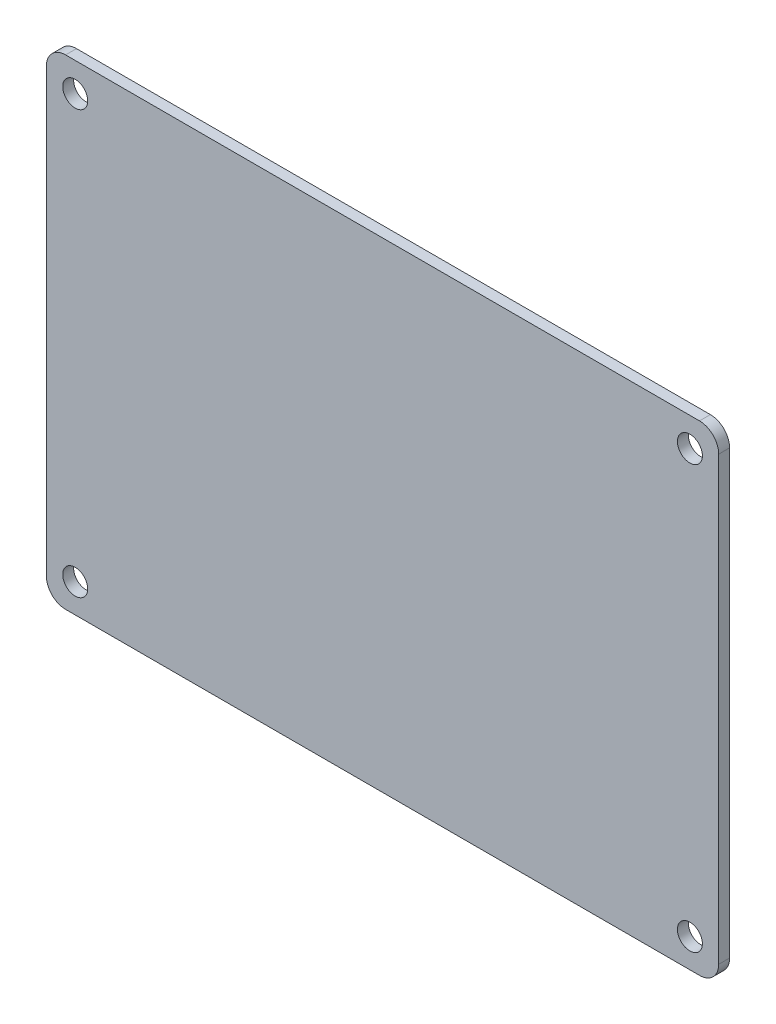
ISO-10303-21;
HEADER;
FILE_DESCRIPTION(('STEP AP214'),'2;1');
FILE_NAME('part.step','',(''),(''),'','','');
FILE_SCHEMA(('AUTOMOTIVE_DESIGN { 1 0 10303 214 1 1 1 1 }'));
ENDSEC;
DATA;
#1=APPLICATION_CONTEXT('core data for automotive mechanical design processes');
#2=APPLICATION_PROTOCOL_DEFINITION('international standard','automotive_design',2000,#1);
#3=PRODUCT_CONTEXT('',#1,'mechanical');
#4=PRODUCT('Part','Part','',(#3));
#5=PRODUCT_RELATED_PRODUCT_CATEGORY('part','',(#4));
#6=PRODUCT_DEFINITION_FORMATION('','',#4);
#7=PRODUCT_DEFINITION_CONTEXT('part definition',#1,'design');
#8=PRODUCT_DEFINITION('design','',#6,#7);
#9=PRODUCT_DEFINITION_SHAPE('','',#8);
#10=(LENGTH_UNIT() NAMED_UNIT(*) SI_UNIT(.MILLI.,.METRE.));
#11=(NAMED_UNIT(*) PLANE_ANGLE_UNIT() SI_UNIT($,.RADIAN.));
#12=(NAMED_UNIT(*) SI_UNIT($,.STERADIAN.) SOLID_ANGLE_UNIT());
#13=UNCERTAINTY_MEASURE_WITH_UNIT(LENGTH_MEASURE(1.E-05),#10,'distance_accuracy_value','');
#14=(GEOMETRIC_REPRESENTATION_CONTEXT(3) GLOBAL_UNCERTAINTY_ASSIGNED_CONTEXT((#13)) GLOBAL_UNIT_ASSIGNED_CONTEXT((#10,
#11,#12)) REPRESENTATION_CONTEXT('',''));
#15=CARTESIAN_POINT('',(0.,0.,0.));
#16=DIRECTION('',(0.,0.,1.));
#17=DIRECTION('',(1.,0.,0.));
#18=AXIS2_PLACEMENT_3D('',#15,#16,#17);
#19=CARTESIAN_POINT('',(-48.,-33.,1.7));
#20=DIRECTION('',(0.,0.,1.));
#21=DIRECTION('',(1.,0.,0.));
#22=AXIS2_PLACEMENT_3D('',#19,#20,#21);
#23=CYLINDRICAL_SURFACE('',#22,1.95);
#24=CARTESIAN_POINT('',(-48.,-33.,0.));
#25=DIRECTION('',(0.,0.,1.));
#26=DIRECTION('',(1.,0.,0.));
#27=AXIS2_PLACEMENT_3D('',#24,#25,#26);
#28=CIRCLE('',#27,1.95);
#29=CARTESIAN_POINT('',(-46.05,-33.,0.));
#30=VERTEX_POINT('',#29);
#31=EDGE_CURVE('E132',#30,#30,#28,.T.);
#32=ORIENTED_EDGE('',*,*,#31,.F.);
#33=EDGE_LOOP('',(#32));
#34=FACE_BOUND('',#33,.T.);
#35=CARTESIAN_POINT('',(-48.,-33.,1.7));
#36=DIRECTION('',(0.,0.,1.));
#37=DIRECTION('',(1.,0.,0.));
#38=AXIS2_PLACEMENT_3D('',#35,#36,#37);
#39=CIRCLE('',#38,1.95);
#40=CARTESIAN_POINT('',(-46.05,-33.,1.7));
#41=VERTEX_POINT('',#40);
#42=EDGE_CURVE('E127',#41,#41,#39,.T.);
#43=ORIENTED_EDGE('',*,*,#42,.T.);
#44=EDGE_LOOP('',(#43));
#45=FACE_BOUND('',#44,.T.);
#46=ADVANCED_FACE('F33',(#34,#45),#23,.F.);
#47=CARTESIAN_POINT('',(48.,-33.,1.7));
#48=DIRECTION('',(0.,0.,1.));
#49=DIRECTION('',(1.,0.,0.));
#50=AXIS2_PLACEMENT_3D('',#47,#48,#49);
#51=CYLINDRICAL_SURFACE('',#50,1.95);
#52=CARTESIAN_POINT('',(48.,-33.,0.));
#53=DIRECTION('',(0.,0.,1.));
#54=DIRECTION('',(1.,0.,0.));
#55=AXIS2_PLACEMENT_3D('',#52,#53,#54);
#56=CIRCLE('',#55,1.95);
#57=CARTESIAN_POINT('',(49.95,-33.,0.));
#58=VERTEX_POINT('',#57);
#59=EDGE_CURVE('E158',#58,#58,#56,.T.);
#60=ORIENTED_EDGE('',*,*,#59,.F.);
#61=EDGE_LOOP('',(#60));
#62=FACE_BOUND('',#61,.T.);
#63=CARTESIAN_POINT('',(48.,-33.,1.7));
#64=DIRECTION('',(0.,0.,1.));
#65=DIRECTION('',(1.,0.,0.));
#66=AXIS2_PLACEMENT_3D('',#63,#64,#65);
#67=CIRCLE('',#66,1.95);
#68=CARTESIAN_POINT('',(49.95,-33.,1.7));
#69=VERTEX_POINT('',#68);
#70=EDGE_CURVE('E162',#69,#69,#67,.T.);
#71=ORIENTED_EDGE('',*,*,#70,.T.);
#72=EDGE_LOOP('',(#71));
#73=FACE_BOUND('',#72,.T.);
#74=ADVANCED_FACE('F181',(#62,#73),#51,.F.);
#75=CARTESIAN_POINT('',(52.5,-37.5,1.7));
#76=DIRECTION('',(0.,-1.,0.));
#77=DIRECTION('',(1.,0.,0.));
#78=AXIS2_PLACEMENT_3D('',#75,#76,#77);
#79=PLANE('',#78);
#80=DIRECTION('',(-1.,0.,0.));
#81=VECTOR('',#80,1.);
#82=CARTESIAN_POINT('',(52.5,-37.5,1.7));
#83=LINE('',#82,#81);
#84=CARTESIAN_POINT('',(49.5,-37.5,1.7));
#85=VERTEX_POINT('',#84);
#86=CARTESIAN_POINT('',(-49.5,-37.5,1.7));
#87=VERTEX_POINT('',#86);
#88=EDGE_CURVE('E172',#85,#87,#83,.T.);
#89=ORIENTED_EDGE('',*,*,#88,.T.);
#90=DIRECTION('',(0.,0.,-1.));
#91=VECTOR('',#90,1.);
#92=CARTESIAN_POINT('',(-49.5,-37.5,1.7));
#93=LINE('',#92,#91);
#94=CARTESIAN_POINT('',(-49.5,-37.5,0.));
#95=VERTEX_POINT('',#94);
#96=EDGE_CURVE('E120',#87,#95,#93,.T.);
#97=ORIENTED_EDGE('',*,*,#96,.T.);
#98=DIRECTION('',(-1.,0.,0.));
#99=VECTOR('',#98,1.);
#100=CARTESIAN_POINT('',(52.5,-37.5,0.));
#101=LINE('',#100,#99);
#102=CARTESIAN_POINT('',(49.5,-37.5,0.));
#103=VERTEX_POINT('',#102);
#104=EDGE_CURVE('E103',#103,#95,#101,.T.);
#105=ORIENTED_EDGE('',*,*,#104,.F.);
#106=DIRECTION('',(0.,0.,-1.));
#107=VECTOR('',#106,1.);
#108=CARTESIAN_POINT('',(49.5,-37.5,1.7));
#109=LINE('',#108,#107);
#110=EDGE_CURVE('E117',#103,#85,#109,.F.);
#111=ORIENTED_EDGE('',*,*,#110,.T.);
#112=EDGE_LOOP('',(#89,#97,#105,#111));
#113=FACE_BOUND('',#112,.T.);
#114=ADVANCED_FACE('F116',(#113),#79,.T.);
#115=CARTESIAN_POINT('',(52.5,-37.5,1.7));
#116=DIRECTION('',(-1.,0.,0.));
#117=DIRECTION('',(0.,0.,1.));
#118=AXIS2_PLACEMENT_3D('',#115,#116,#117);
#119=PLANE('',#118);
#120=DIRECTION('',(0.,1.,0.));
#121=VECTOR('',#120,1.);
#122=CARTESIAN_POINT('',(52.5,-37.5,1.7));
#123=LINE('',#122,#121);
#124=CARTESIAN_POINT('',(52.5,-34.5,1.7));
#125=VERTEX_POINT('',#124);
#126=CARTESIAN_POINT('',(52.5,34.5,1.7));
#127=VERTEX_POINT('',#126);
#128=EDGE_CURVE('E157',#125,#127,#123,.T.);
#129=ORIENTED_EDGE('',*,*,#128,.F.);
#130=DIRECTION('',(0.,0.,-1.));
#131=VECTOR('',#130,1.);
#132=CARTESIAN_POINT('',(52.5,-34.5,0.));
#133=LINE('',#132,#131);
#134=CARTESIAN_POINT('',(52.5,-34.5,0.));
#135=VERTEX_POINT('',#134);
#136=EDGE_CURVE('E152',#125,#135,#133,.T.);
#137=ORIENTED_EDGE('',*,*,#136,.T.);
#138=DIRECTION('',(0.,1.,0.));
#139=VECTOR('',#138,1.);
#140=CARTESIAN_POINT('',(52.5,-37.5,0.));
#141=LINE('',#140,#139);
#142=CARTESIAN_POINT('',(52.5,34.5,0.));
#143=VERTEX_POINT('',#142);
#144=EDGE_CURVE('E105',#135,#143,#141,.T.);
#145=ORIENTED_EDGE('',*,*,#144,.T.);
#146=DIRECTION('',(0.,0.,-1.));
#147=VECTOR('',#146,1.);
#148=CARTESIAN_POINT('',(52.5,34.5,1.7));
#149=LINE('',#148,#147);
#150=EDGE_CURVE('E150',#143,#127,#149,.F.);
#151=ORIENTED_EDGE('',*,*,#150,.T.);
#152=EDGE_LOOP('',(#129,#137,#145,#151));
#153=FACE_BOUND('',#152,.T.);
#154=ADVANCED_FACE('F155',(#153),#119,.F.);
#155=CARTESIAN_POINT('',(52.5,37.5,1.7));
#156=DIRECTION('',(0.,-1.,0.));
#157=DIRECTION('',(1.,0.,0.));
#158=AXIS2_PLACEMENT_3D('',#155,#156,#157);
#159=PLANE('',#158);
#160=DIRECTION('',(-1.,0.,0.));
#161=VECTOR('',#160,1.);
#162=CARTESIAN_POINT('',(52.5,37.5,1.7));
#163=LINE('',#162,#161);
#164=CARTESIAN_POINT('',(49.5,37.5,1.7));
#165=VERTEX_POINT('',#164);
#166=CARTESIAN_POINT('',(-49.5,37.5,1.7));
#167=VERTEX_POINT('',#166);
#168=EDGE_CURVE('E159',#165,#167,#163,.T.);
#169=ORIENTED_EDGE('',*,*,#168,.F.);
#170=DIRECTION('',(0.,0.,-1.));
#171=VECTOR('',#170,1.);
#172=CARTESIAN_POINT('',(49.5,37.5,1.7));
#173=LINE('',#172,#171);
#174=CARTESIAN_POINT('',(49.5,37.5,0.));
#175=VERTEX_POINT('',#174);
#176=EDGE_CURVE('E11',#165,#175,#173,.T.);
#177=ORIENTED_EDGE('',*,*,#176,.T.);
#178=DIRECTION('',(-1.,0.,0.));
#179=VECTOR('',#178,1.);
#180=CARTESIAN_POINT('',(52.5,37.5,0.));
#181=LINE('',#180,#179);
#182=CARTESIAN_POINT('',(-49.5,37.5,0.));
#183=VERTEX_POINT('',#182);
#184=EDGE_CURVE('E170',#175,#183,#181,.T.);
#185=ORIENTED_EDGE('',*,*,#184,.T.);
#186=DIRECTION('',(0.,0.,-1.));
#187=VECTOR('',#186,1.);
#188=CARTESIAN_POINT('',(-49.5,37.5,1.7));
#189=LINE('',#188,#187);
#190=EDGE_CURVE('E41',#183,#167,#189,.F.);
#191=ORIENTED_EDGE('',*,*,#190,.T.);
#192=EDGE_LOOP('',(#169,#177,#185,#191));
#193=FACE_BOUND('',#192,.T.);
#194=ADVANCED_FACE('F197',(#193),#159,.F.);
#195=CARTESIAN_POINT('',(-52.5,-37.5,1.7));
#196=DIRECTION('',(-1.,0.,0.));
#197=DIRECTION('',(0.,0.,1.));
#198=AXIS2_PLACEMENT_3D('',#195,#196,#197);
#199=PLANE('',#198);
#200=DIRECTION('',(0.,1.,0.));
#201=VECTOR('',#200,1.);
#202=CARTESIAN_POINT('',(-52.5,-37.5,0.));
#203=LINE('',#202,#201);
#204=CARTESIAN_POINT('',(-52.5,-34.5,0.));
#205=VERTEX_POINT('',#204);
#206=CARTESIAN_POINT('',(-52.5,34.5,0.));
#207=VERTEX_POINT('',#206);
#208=EDGE_CURVE('E121',#205,#207,#203,.T.);
#209=ORIENTED_EDGE('',*,*,#208,.F.);
#210=DIRECTION('',(0.,0.,-1.));
#211=VECTOR('',#210,1.);
#212=CARTESIAN_POINT('',(-52.5,-34.5,1.7));
#213=LINE('',#212,#211);
#214=CARTESIAN_POINT('',(-52.5,-34.5,1.7));
#215=VERTEX_POINT('',#214);
#216=EDGE_CURVE('E142',#205,#215,#213,.F.);
#217=ORIENTED_EDGE('',*,*,#216,.T.);
#218=DIRECTION('',(0.,1.,0.));
#219=VECTOR('',#218,1.);
#220=CARTESIAN_POINT('',(-52.5,-37.5,1.7));
#221=LINE('',#220,#219);
#222=CARTESIAN_POINT('',(-52.5,34.5,1.7));
#223=VERTEX_POINT('',#222);
#224=EDGE_CURVE('E164',#215,#223,#221,.T.);
#225=ORIENTED_EDGE('',*,*,#224,.T.);
#226=DIRECTION('',(0.,0.,-1.));
#227=VECTOR('',#226,1.);
#228=CARTESIAN_POINT('',(-52.5,34.5,0.));
#229=LINE('',#228,#227);
#230=EDGE_CURVE('E139',#223,#207,#229,.T.);
#231=ORIENTED_EDGE('',*,*,#230,.T.);
#232=EDGE_LOOP('',(#209,#217,#225,#231));
#233=FACE_BOUND('',#232,.T.);
#234=ADVANCED_FACE('F187',(#233),#199,.T.);
#235=CARTESIAN_POINT('',(0.,0.,1.7));
#236=DIRECTION('',(0.,0.,-1.));
#237=DIRECTION('',(-1.,0.,0.));
#238=AXIS2_PLACEMENT_3D('',#235,#236,#237);
#239=PLANE('',#238);
#240=CARTESIAN_POINT('',(-48.,33.,1.7));
#241=DIRECTION('',(0.,0.,1.));
#242=DIRECTION('',(1.,0.,0.));
#243=AXIS2_PLACEMENT_3D('',#240,#241,#242);
#244=CIRCLE('',#243,1.95);
#245=CARTESIAN_POINT('',(-46.05,33.,1.7));
#246=VERTEX_POINT('',#245);
#247=EDGE_CURVE('E243',#246,#246,#244,.T.);
#248=ORIENTED_EDGE('',*,*,#247,.F.);
#249=EDGE_LOOP('',(#248));
#250=FACE_BOUND('',#249,.T.);
#251=CARTESIAN_POINT('',(48.,33.,1.7));
#252=DIRECTION('',(0.,0.,1.));
#253=DIRECTION('',(1.,0.,0.));
#254=AXIS2_PLACEMENT_3D('',#251,#252,#253);
#255=CIRCLE('',#254,1.95);
#256=CARTESIAN_POINT('',(49.95,33.,1.7));
#257=VERTEX_POINT('',#256);
#258=EDGE_CURVE('E240',#257,#257,#255,.T.);
#259=ORIENTED_EDGE('',*,*,#258,.F.);
#260=EDGE_LOOP('',(#259));
#261=FACE_BOUND('',#260,.T.);
#262=ORIENTED_EDGE('',*,*,#224,.F.);
#263=CARTESIAN_POINT('',(-49.5,-34.5,1.7));
#264=DIRECTION('',(0.,0.,-1.));
#265=DIRECTION('',(-1.,0.,0.));
#266=AXIS2_PLACEMENT_3D('',#263,#264,#265);
#267=CIRCLE('',#266,3.);
#268=EDGE_CURVE('E148',#215,#87,#267,.F.);
#269=ORIENTED_EDGE('',*,*,#268,.T.);
#270=ORIENTED_EDGE('',*,*,#88,.F.);
#271=CARTESIAN_POINT('',(49.5,-34.5,1.7));
#272=DIRECTION('',(0.,0.,-1.));
#273=DIRECTION('',(-1.,0.,0.));
#274=AXIS2_PLACEMENT_3D('',#271,#272,#273);
#275=CIRCLE('',#274,3.);
#276=EDGE_CURVE('E126',#85,#125,#275,.F.);
#277=ORIENTED_EDGE('',*,*,#276,.T.);
#278=ORIENTED_EDGE('',*,*,#128,.T.);
#279=CARTESIAN_POINT('',(49.5,34.5,1.7));
#280=DIRECTION('',(0.,0.,-1.));
#281=DIRECTION('',(-1.,0.,0.));
#282=AXIS2_PLACEMENT_3D('',#279,#280,#281);
#283=CIRCLE('',#282,3.);
#284=EDGE_CURVE('E54',#127,#165,#283,.F.);
#285=ORIENTED_EDGE('',*,*,#284,.T.);
#286=ORIENTED_EDGE('',*,*,#168,.T.);
#287=CARTESIAN_POINT('',(-49.5,34.5,1.7));
#288=DIRECTION('',(0.,0.,-1.));
#289=DIRECTION('',(-1.,0.,0.));
#290=AXIS2_PLACEMENT_3D('',#287,#288,#289);
#291=CIRCLE('',#290,3.);
#292=EDGE_CURVE('E144',#167,#223,#291,.F.);
#293=ORIENTED_EDGE('',*,*,#292,.T.);
#294=EDGE_LOOP('',(#262,#269,#270,#277,#278,#285,#286,#293));
#295=FACE_BOUND('',#294,.T.);
#296=ORIENTED_EDGE('',*,*,#70,.F.);
#297=EDGE_LOOP('',(#296));
#298=FACE_BOUND('',#297,.T.);
#299=ORIENTED_EDGE('',*,*,#42,.F.);
#300=EDGE_LOOP('',(#299));
#301=FACE_BOUND('',#300,.T.);
#302=ADVANCED_FACE('F185',(#250,#261,#295,#298,#301),#239,.F.);
#303=CARTESIAN_POINT('',(0.,0.,0.));
#304=DIRECTION('',(0.,0.,-1.));
#305=DIRECTION('',(-1.,0.,0.));
#306=AXIS2_PLACEMENT_3D('',#303,#304,#305);
#307=PLANE('',#306);
#308=CARTESIAN_POINT('',(-48.,33.,0.));
#309=DIRECTION('',(0.,0.,1.));
#310=DIRECTION('',(1.,0.,0.));
#311=AXIS2_PLACEMENT_3D('',#308,#309,#310);
#312=CIRCLE('',#311,1.95);
#313=CARTESIAN_POINT('',(-46.05,33.,0.));
#314=VERTEX_POINT('',#313);
#315=EDGE_CURVE('E246',#314,#314,#312,.T.);
#316=ORIENTED_EDGE('',*,*,#315,.T.);
#317=EDGE_LOOP('',(#316));
#318=FACE_BOUND('',#317,.T.);
#319=CARTESIAN_POINT('',(48.,33.,0.));
#320=DIRECTION('',(0.,0.,1.));
#321=DIRECTION('',(1.,0.,0.));
#322=AXIS2_PLACEMENT_3D('',#319,#320,#321);
#323=CIRCLE('',#322,1.95);
#324=CARTESIAN_POINT('',(49.95,33.,0.));
#325=VERTEX_POINT('',#324);
#326=EDGE_CURVE('E122',#325,#325,#323,.T.);
#327=ORIENTED_EDGE('',*,*,#326,.T.);
#328=EDGE_LOOP('',(#327));
#329=FACE_BOUND('',#328,.T.);
#330=ORIENTED_EDGE('',*,*,#104,.T.);
#331=CARTESIAN_POINT('',(-49.5,-34.5,0.));
#332=DIRECTION('',(0.,0.,-1.));
#333=DIRECTION('',(-1.,0.,0.));
#334=AXIS2_PLACEMENT_3D('',#331,#332,#333);
#335=CIRCLE('',#334,3.);
#336=EDGE_CURVE('E110',#95,#205,#335,.T.);
#337=ORIENTED_EDGE('',*,*,#336,.T.);
#338=ORIENTED_EDGE('',*,*,#208,.T.);
#339=CARTESIAN_POINT('',(-49.5,34.5,0.));
#340=DIRECTION('',(0.,0.,-1.));
#341=DIRECTION('',(-1.,0.,0.));
#342=AXIS2_PLACEMENT_3D('',#339,#340,#341);
#343=CIRCLE('',#342,3.);
#344=EDGE_CURVE('E129',#207,#183,#343,.T.);
#345=ORIENTED_EDGE('',*,*,#344,.T.);
#346=ORIENTED_EDGE('',*,*,#184,.F.);
#347=CARTESIAN_POINT('',(49.5,34.5,0.));
#348=DIRECTION('',(0.,0.,-1.));
#349=DIRECTION('',(-1.,0.,0.));
#350=AXIS2_PLACEMENT_3D('',#347,#348,#349);
#351=CIRCLE('',#350,3.);
#352=EDGE_CURVE('E111',#175,#143,#351,.T.);
#353=ORIENTED_EDGE('',*,*,#352,.T.);
#354=ORIENTED_EDGE('',*,*,#144,.F.);
#355=CARTESIAN_POINT('',(49.5,-34.5,0.));
#356=DIRECTION('',(0.,0.,-1.));
#357=DIRECTION('',(-1.,0.,0.));
#358=AXIS2_PLACEMENT_3D('',#355,#356,#357);
#359=CIRCLE('',#358,3.);
#360=EDGE_CURVE('E99',#135,#103,#359,.T.);
#361=ORIENTED_EDGE('',*,*,#360,.T.);
#362=EDGE_LOOP('',(#330,#337,#338,#345,#346,#353,#354,#361));
#363=FACE_BOUND('',#362,.T.);
#364=ORIENTED_EDGE('',*,*,#59,.T.);
#365=EDGE_LOOP('',(#364));
#366=FACE_BOUND('',#365,.T.);
#367=ORIENTED_EDGE('',*,*,#31,.T.);
#368=EDGE_LOOP('',(#367));
#369=FACE_BOUND('',#368,.T.);
#370=ADVANCED_FACE('F101',(#318,#329,#363,#366,#369),#307,.T.);
#371=CARTESIAN_POINT('',(48.,33.,1.7));
#372=DIRECTION('',(0.,0.,1.));
#373=DIRECTION('',(1.,0.,0.));
#374=AXIS2_PLACEMENT_3D('',#371,#372,#373);
#375=CYLINDRICAL_SURFACE('',#374,1.95);
#376=ORIENTED_EDGE('',*,*,#326,.F.);
#377=EDGE_LOOP('',(#376));
#378=FACE_BOUND('',#377,.T.);
#379=ORIENTED_EDGE('',*,*,#258,.T.);
#380=EDGE_LOOP('',(#379));
#381=FACE_BOUND('',#380,.T.);
#382=ADVANCED_FACE('F194',(#378,#381),#375,.F.);
#383=CARTESIAN_POINT('',(-48.,33.,1.7));
#384=DIRECTION('',(0.,0.,1.));
#385=DIRECTION('',(1.,0.,0.));
#386=AXIS2_PLACEMENT_3D('',#383,#384,#385);
#387=CYLINDRICAL_SURFACE('',#386,1.95);
#388=ORIENTED_EDGE('',*,*,#315,.F.);
#389=EDGE_LOOP('',(#388));
#390=FACE_BOUND('',#389,.T.);
#391=ORIENTED_EDGE('',*,*,#247,.T.);
#392=EDGE_LOOP('',(#391));
#393=FACE_BOUND('',#392,.T.);
#394=ADVANCED_FACE('F217',(#390,#393),#387,.F.);
#395=CARTESIAN_POINT('',(-49.5,-34.5,1.7));
#396=DIRECTION('',(0.,0.,-1.));
#397=DIRECTION('',(-1.,0.,0.));
#398=AXIS2_PLACEMENT_3D('',#395,#396,#397);
#399=CYLINDRICAL_SURFACE('',#398,3.);
#400=ORIENTED_EDGE('',*,*,#268,.F.);
#401=ORIENTED_EDGE('',*,*,#216,.F.);
#402=ORIENTED_EDGE('',*,*,#336,.F.);
#403=ORIENTED_EDGE('',*,*,#96,.F.);
#404=EDGE_LOOP('',(#400,#401,#402,#403));
#405=FACE_BOUND('',#404,.T.);
#406=ADVANCED_FACE('F214',(#405),#399,.T.);
#407=CARTESIAN_POINT('',(49.5,-34.5,1.7));
#408=DIRECTION('',(0.,0.,1.));
#409=DIRECTION('',(1.,0.,0.));
#410=AXIS2_PLACEMENT_3D('',#407,#408,#409);
#411=CYLINDRICAL_SURFACE('',#410,3.);
#412=ORIENTED_EDGE('',*,*,#276,.F.);
#413=ORIENTED_EDGE('',*,*,#110,.F.);
#414=ORIENTED_EDGE('',*,*,#360,.F.);
#415=ORIENTED_EDGE('',*,*,#136,.F.);
#416=EDGE_LOOP('',(#412,#413,#414,#415));
#417=FACE_BOUND('',#416,.T.);
#418=ADVANCED_FACE('F125',(#417),#411,.T.);
#419=CARTESIAN_POINT('',(49.5,34.5,1.7));
#420=DIRECTION('',(0.,0.,-1.));
#421=DIRECTION('',(-1.,0.,0.));
#422=AXIS2_PLACEMENT_3D('',#419,#420,#421);
#423=CYLINDRICAL_SURFACE('',#422,3.);
#424=ORIENTED_EDGE('',*,*,#284,.F.);
#425=ORIENTED_EDGE('',*,*,#150,.F.);
#426=ORIENTED_EDGE('',*,*,#352,.F.);
#427=ORIENTED_EDGE('',*,*,#176,.F.);
#428=EDGE_LOOP('',(#424,#425,#426,#427));
#429=FACE_BOUND('',#428,.T.);
#430=ADVANCED_FACE('F220',(#429),#423,.T.);
#431=CARTESIAN_POINT('',(-49.5,34.5,1.7));
#432=DIRECTION('',(0.,0.,1.));
#433=DIRECTION('',(1.,0.,0.));
#434=AXIS2_PLACEMENT_3D('',#431,#432,#433);
#435=CYLINDRICAL_SURFACE('',#434,3.);
#436=ORIENTED_EDGE('',*,*,#292,.F.);
#437=ORIENTED_EDGE('',*,*,#190,.F.);
#438=ORIENTED_EDGE('',*,*,#344,.F.);
#439=ORIENTED_EDGE('',*,*,#230,.F.);
#440=EDGE_LOOP('',(#436,#437,#438,#439));
#441=FACE_BOUND('',#440,.T.);
#442=ADVANCED_FACE('F35',(#441),#435,.T.);
#443=CLOSED_SHELL('',(#46,#74,#114,#154,#194,#234,#302,#370,#382,#394,#406,#418,#430,#442));
#444=MANIFOLD_SOLID_BREP('B2',#443);
#445=ADVANCED_BREP_SHAPE_REPRESENTATION('',(#18,#444),#14);
#446=SHAPE_DEFINITION_REPRESENTATION(#9,#445);
ENDSEC;
END-ISO-10303-21;
